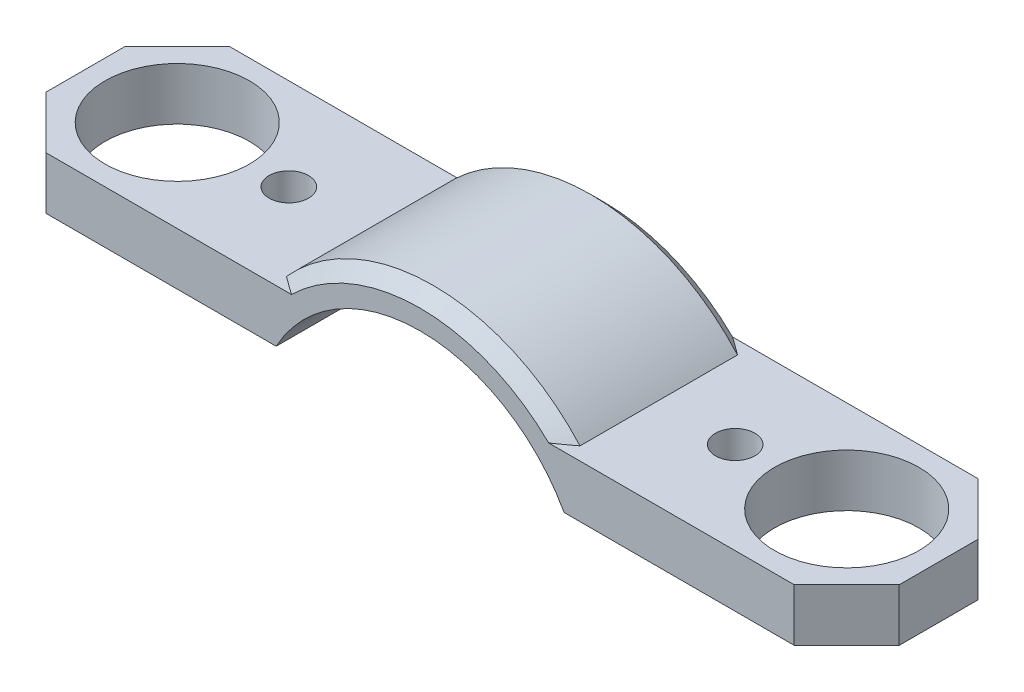
ISO-10303-21;
HEADER;
FILE_DESCRIPTION(('STEP AP214'),'2;1');
FILE_NAME('part.step','',(''),(''),'','','');
FILE_SCHEMA(('AUTOMOTIVE_DESIGN { 1 0 10303 214 1 1 1 1 }'));
ENDSEC;
DATA;
#1=APPLICATION_CONTEXT('core data for automotive mechanical design processes');
#2=APPLICATION_PROTOCOL_DEFINITION('international standard','automotive_design',2000,#1);
#3=PRODUCT_CONTEXT('',#1,'mechanical');
#4=PRODUCT('Part','Part','',(#3));
#5=PRODUCT_RELATED_PRODUCT_CATEGORY('part','',(#4));
#6=PRODUCT_DEFINITION_FORMATION('','',#4);
#7=PRODUCT_DEFINITION_CONTEXT('part definition',#1,'design');
#8=PRODUCT_DEFINITION('design','',#6,#7);
#9=PRODUCT_DEFINITION_SHAPE('','',#8);
#10=(LENGTH_UNIT() NAMED_UNIT(*) SI_UNIT(.MILLI.,.METRE.));
#11=(NAMED_UNIT(*) PLANE_ANGLE_UNIT() SI_UNIT($,.RADIAN.));
#12=(NAMED_UNIT(*) SI_UNIT($,.STERADIAN.) SOLID_ANGLE_UNIT());
#13=UNCERTAINTY_MEASURE_WITH_UNIT(LENGTH_MEASURE(1.E-05),#10,'distance_accuracy_value','');
#14=(GEOMETRIC_REPRESENTATION_CONTEXT(3) GLOBAL_UNCERTAINTY_ASSIGNED_CONTEXT((#13)) GLOBAL_UNIT_ASSIGNED_CONTEXT((#10,
#11,#12)) REPRESENTATION_CONTEXT('',''));
#15=CARTESIAN_POINT('',(0.,0.,0.));
#16=DIRECTION('',(0.,0.,1.));
#17=DIRECTION('',(1.,0.,0.));
#18=AXIS2_PLACEMENT_3D('',#15,#16,#17);
#19=CARTESIAN_POINT('',(0.,-4.,0.));
#20=DIRECTION('',(0.,1.,0.));
#21=DIRECTION('',(0.,0.,1.));
#22=AXIS2_PLACEMENT_3D('',#19,#20,#21);
#23=PLANE('',#22);
#24=CARTESIAN_POINT('',(13.6739012317805,-4.,2.35283109435819));
#25=DIRECTION('',(0.,-1.,0.));
#26=DIRECTION('',(0.,0.,-1.));
#27=AXIS2_PLACEMENT_3D('',#24,#25,#26);
#28=CIRCLE('',#27,1.5);
#29=CARTESIAN_POINT('',(13.6739012317805,-4.,0.852831094358193));
#30=VERTEX_POINT('',#29);
#31=EDGE_CURVE('E331',#30,#30,#28,.T.);
#32=ORIENTED_EDGE('',*,*,#31,.F.);
#33=EDGE_LOOP('',(#32));
#34=FACE_BOUND('',#33,.T.);
#35=CARTESIAN_POINT('',(22.1739012317805,-4.,2.35283109435819));
#36=DIRECTION('',(0.,-1.,0.));
#37=DIRECTION('',(0.,0.,-1.));
#38=AXIS2_PLACEMENT_3D('',#35,#36,#37);
#39=CIRCLE('',#38,5.5);
#40=CARTESIAN_POINT('',(22.1739012317805,-4.,-3.1471689056418));
#41=VERTEX_POINT('',#40);
#42=EDGE_CURVE('E319',#41,#41,#39,.T.);
#43=ORIENTED_EDGE('',*,*,#42,.F.);
#44=EDGE_LOOP('',(#43));
#45=FACE_BOUND('',#44,.T.);
#46=DIRECTION('',(-1.,0.,0.));
#47=VECTOR('',#46,1.);
#48=CARTESIAN_POINT('',(-35.8260987682195,-4.,-4.64716890564181));
#49=LINE('',#48,#47);
#50=CARTESIAN_POINT('',(25.1739012317805,-4.,-4.64716890564181));
#51=VERTEX_POINT('',#50);
#52=CARTESIAN_POINT('',(7.6397573315112,-4.,-4.64716890564181));
#53=VERTEX_POINT('',#52);
#54=EDGE_CURVE('E161',#51,#53,#49,.T.);
#55=ORIENTED_EDGE('',*,*,#54,.F.);
#56=DIRECTION('',(-0.707106781186549,0.,-0.707106781186546));
#57=VECTOR('',#56,1.);
#58=CARTESIAN_POINT('',(29.1739012317805,-4.,-0.647168905641817));
#59=LINE('',#58,#57);
#60=CARTESIAN_POINT('',(29.1739012317805,-4.,-0.647168905641816));
#61=VERTEX_POINT('',#60);
#62=EDGE_CURVE('E223',#51,#61,#59,.F.);
#63=ORIENTED_EDGE('',*,*,#62,.T.);
#64=DIRECTION('',(0.,0.,-1.));
#65=VECTOR('',#64,1.);
#66=CARTESIAN_POINT('',(29.1739012317805,-4.,-4.64716890564181));
#67=LINE('',#66,#65);
#68=CARTESIAN_POINT('',(29.1739012317805,-4.,5.35283109435819));
#69=VERTEX_POINT('',#68);
#70=EDGE_CURVE('E167',#69,#61,#67,.T.);
#71=ORIENTED_EDGE('',*,*,#70,.F.);
#72=DIRECTION('',(0.707106781186546,0.,-0.707106781186549));
#73=VECTOR('',#72,1.);
#74=CARTESIAN_POINT('',(25.1739012317806,-4.,9.35283109435819));
#75=LINE('',#74,#73);
#76=CARTESIAN_POINT('',(25.1739012317806,-4.,9.35283109435819));
#77=VERTEX_POINT('',#76);
#78=EDGE_CURVE('E221',#69,#77,#75,.F.);
#79=ORIENTED_EDGE('',*,*,#78,.T.);
#80=DIRECTION('',(1.,0.,0.));
#81=VECTOR('',#80,1.);
#82=CARTESIAN_POINT('',(-35.8260987682195,-4.,9.35283109435819));
#83=LINE('',#82,#81);
#84=CARTESIAN_POINT('',(7.6397573315112,-4.,9.35283109435819));
#85=VERTEX_POINT('',#84);
#86=EDGE_CURVE('E310',#85,#77,#83,.T.);
#87=ORIENTED_EDGE('',*,*,#86,.F.);
#88=DIRECTION('',(0.,0.,-1.));
#89=VECTOR('',#88,1.);
#90=CARTESIAN_POINT('',(7.6397573315112,-4.,9.35283109435819));
#91=LINE('',#90,#89);
#92=EDGE_CURVE('E150',#85,#53,#91,.T.);
#93=ORIENTED_EDGE('',*,*,#92,.T.);
#94=EDGE_LOOP('',(#55,#63,#71,#79,#87,#93));
#95=FACE_BOUND('',#94,.T.);
#96=ADVANCED_FACE('F33',(#34,#45,#95),#23,.F.);
#97=CARTESIAN_POINT('',(0.,0.,0.));
#98=DIRECTION('',(0.,1.,0.));
#99=DIRECTION('',(0.,0.,1.));
#100=AXIS2_PLACEMENT_3D('',#97,#98,#99);
#101=PLANE('',#100);
#102=DIRECTION('',(0.,0.,-1.));
#103=VECTOR('',#102,1.);
#104=CARTESIAN_POINT('',(29.1739012317805,0.,-4.64716890564181));
#105=LINE('',#104,#103);
#106=CARTESIAN_POINT('',(29.1739012317805,0.,5.35283109435819));
#107=VERTEX_POINT('',#106);
#108=CARTESIAN_POINT('',(29.1739012317805,0.,-0.647168905641813));
#109=VERTEX_POINT('',#108);
#110=EDGE_CURVE('E180',#107,#109,#105,.T.);
#111=ORIENTED_EDGE('',*,*,#110,.T.);
#112=DIRECTION('',(0.707106781186549,0.,0.707106781186546));
#113=VECTOR('',#112,1.);
#114=CARTESIAN_POINT('',(14.9105350687111,0.,-14.9105350687112));
#115=LINE('',#114,#113);
#116=CARTESIAN_POINT('',(25.1739012317805,0.,-4.64716890564181));
#117=VERTEX_POINT('',#116);
#118=EDGE_CURVE('E219',#109,#117,#115,.F.);
#119=ORIENTED_EDGE('',*,*,#118,.T.);
#120=DIRECTION('',(-1.,0.,0.));
#121=VECTOR('',#120,1.);
#122=CARTESIAN_POINT('',(-35.8260987682195,0.,-4.64716890564181));
#123=LINE('',#122,#121);
#124=CARTESIAN_POINT('',(6.47186020291327,0.,-4.64716890564181));
#125=VERTEX_POINT('',#124);
#126=EDGE_CURVE('E184',#117,#125,#123,.T.);
#127=ORIENTED_EDGE('',*,*,#126,.T.);
#128=CARTESIAN_POINT('',(6.47186020291327,0.,-4.64716890564181));
#129=CARTESIAN_POINT('',(6.58835406583274,0.,-4.56563878984489));
#130=CARTESIAN_POINT('',(6.7045002071197,0.,-4.48361298310186));
#131=CARTESIAN_POINT('',(6.93612812483899,0.,-4.31864203807849));
#132=CARTESIAN_POINT('',(7.05160993790389,0.,-4.23569695124202));
#133=CARTESIAN_POINT('',(7.28195258256229,0.,-4.06895087953328));
#134=CARTESIAN_POINT('',(7.39681341770906,0.,-3.98514989956645));
#135=CARTESIAN_POINT('',(7.62595525736224,0.,-3.81674548549887));
#136=CARTESIAN_POINT('',(7.74023622922977,0.,-3.7321420069802));
#137=CARTESIAN_POINT('',(7.85424111927951,0.,-3.64716890564184));
#138=B_SPLINE_CURVE_WITH_KNOTS('',3,(#128,#129,#130,#131,#132,#133,#134,#135,#136,#137),
.UNSPECIFIED.,.F.,.F.,(4,2,2,2,4),(0.,0.426567590976708,0.853111430127949,1.27965282597465,
1.70621797007616),.UNSPECIFIED.);
#139=CARTESIAN_POINT('',(7.85424111927949,0.,-3.64716890564182));
#140=VERTEX_POINT('',#139);
#141=EDGE_CURVE('E234',#125,#140,#138,.T.);
#142=ORIENTED_EDGE('',*,*,#141,.T.);
#143=DIRECTION('',(0.,0.,-1.));
#144=VECTOR('',#143,1.);
#145=CARTESIAN_POINT('',(7.85424111927949,0.,9.35283109435819));
#146=LINE('',#145,#144);
#147=CARTESIAN_POINT('',(7.85424111927949,0.,8.3528310943582));
#148=VERTEX_POINT('',#147);
#149=EDGE_CURVE('E151',#148,#140,#146,.T.);
#150=ORIENTED_EDGE('',*,*,#149,.F.);
#151=CARTESIAN_POINT('',(7.85424111927949,0.,8.3528310943582));
#152=CARTESIAN_POINT('',(7.74023622922976,0.,8.43780419569658));
#153=CARTESIAN_POINT('',(7.62595525736224,0.,8.52240767421525));
#154=CARTESIAN_POINT('',(7.39681341770905,0.,8.69081208828284));
#155=CARTESIAN_POINT('',(7.28195258256228,0.,8.77461306824967));
#156=CARTESIAN_POINT('',(7.05160993790387,0.,8.9413591399584));
#157=CARTESIAN_POINT('',(6.93612812483897,0.,9.02430422679487));
#158=CARTESIAN_POINT('',(6.70450020711968,0.,9.18927517181825));
#159=CARTESIAN_POINT('',(6.58835406583272,0.,9.2713009785613));
#160=CARTESIAN_POINT('',(6.47186020291327,0.,9.35283109435824));
#161=B_SPLINE_CURVE_WITH_KNOTS('',3,(#151,#152,#153,#154,#155,#156,#157,#158,#159,#160),
.UNSPECIFIED.,.F.,.F.,(4,2,2,2,4),(0.,0.426565144101509,0.853106539948222,1.27965037909947,
1.70621797007619),.UNSPECIFIED.);
#162=CARTESIAN_POINT('',(6.47186020291324,0.,9.35283109435819));
#163=VERTEX_POINT('',#162);
#164=EDGE_CURVE('E46',#148,#163,#161,.T.);
#165=ORIENTED_EDGE('',*,*,#164,.T.);
#166=DIRECTION('',(1.,0.,0.));
#167=VECTOR('',#166,1.);
#168=CARTESIAN_POINT('',(-35.8260987682195,0.,9.35283109435819));
#169=LINE('',#168,#167);
#170=CARTESIAN_POINT('',(25.1739012317806,0.,9.35283109435819));
#171=VERTEX_POINT('',#170);
#172=EDGE_CURVE('E53',#163,#171,#169,.T.);
#173=ORIENTED_EDGE('',*,*,#172,.T.);
#174=DIRECTION('',(-0.707106781186546,0.,0.707106781186549));
#175=VECTOR('',#174,1.);
#176=CARTESIAN_POINT('',(17.2633661630694,0.,17.2633661630694));
#177=LINE('',#176,#175);
#178=EDGE_CURVE('E217',#171,#107,#177,.F.);
#179=ORIENTED_EDGE('',*,*,#178,.T.);
#180=EDGE_LOOP('',(#111,#119,#127,#142,#150,#165,#173,#179));
#181=FACE_BOUND('',#180,.T.);
#182=CARTESIAN_POINT('',(22.1739012317805,0.,2.35283109435819));
#183=DIRECTION('',(0.,-1.,0.));
#184=DIRECTION('',(0.,0.,-1.));
#185=AXIS2_PLACEMENT_3D('',#182,#183,#184);
#186=CIRCLE('',#185,5.5);
#187=CARTESIAN_POINT('',(22.1739012317805,0.,-3.1471689056418));
#188=VERTEX_POINT('',#187);
#189=EDGE_CURVE('E316',#188,#188,#186,.T.);
#190=ORIENTED_EDGE('',*,*,#189,.T.);
#191=EDGE_LOOP('',(#190));
#192=FACE_BOUND('',#191,.T.);
#193=CARTESIAN_POINT('',(13.6739012317805,0.,2.35283109435819));
#194=DIRECTION('',(0.,-1.,0.));
#195=DIRECTION('',(0.,0.,-1.));
#196=AXIS2_PLACEMENT_3D('',#193,#194,#195);
#197=CIRCLE('',#196,1.5);
#198=CARTESIAN_POINT('',(13.6739012317805,0.,0.852831094358193));
#199=VERTEX_POINT('',#198);
#200=EDGE_CURVE('E328',#199,#199,#197,.T.);
#201=ORIENTED_EDGE('',*,*,#200,.T.);
#202=EDGE_LOOP('',(#201));
#203=FACE_BOUND('',#202,.T.);
#204=ADVANCED_FACE('F252',(#181,#192,#203),#101,.T.);
#205=CARTESIAN_POINT('',(-35.8260987682195,-4.,-4.64716890564181));
#206=DIRECTION('',(-1.,0.,0.));
#207=DIRECTION('',(0.,0.,1.));
#208=AXIS2_PLACEMENT_3D('',#205,#206,#207);
#209=PLANE('',#208);
#210=DIRECTION('',(0.,0.,1.));
#211=VECTOR('',#210,1.);
#212=CARTESIAN_POINT('',(-35.8260987682195,0.,-4.64716890564181));
#213=LINE('',#212,#211);
#214=CARTESIAN_POINT('',(-35.8260987682195,0.,-0.647168905641802));
#215=VERTEX_POINT('',#214);
#216=CARTESIAN_POINT('',(-35.8260987682195,0.,5.35283109435819));
#217=VERTEX_POINT('',#216);
#218=EDGE_CURVE('E175',#215,#217,#213,.T.);
#219=ORIENTED_EDGE('',*,*,#218,.F.);
#220=DIRECTION('',(0.,-1.,0.));
#221=VECTOR('',#220,1.);
#222=CARTESIAN_POINT('',(-35.8260987682195,-4.,-0.647168905641802));
#223=LINE('',#222,#221);
#224=CARTESIAN_POINT('',(-35.8260987682195,-4.,-0.647168905641802));
#225=VERTEX_POINT('',#224);
#226=EDGE_CURVE('E203',#215,#225,#223,.T.);
#227=ORIENTED_EDGE('',*,*,#226,.T.);
#228=DIRECTION('',(0.,0.,1.));
#229=VECTOR('',#228,1.);
#230=CARTESIAN_POINT('',(-35.8260987682195,-4.,-4.64716890564181));
#231=LINE('',#230,#229);
#232=CARTESIAN_POINT('',(-35.8260987682195,-4.,5.3528310943582));
#233=VERTEX_POINT('',#232);
#234=EDGE_CURVE('E186',#225,#233,#231,.T.);
#235=ORIENTED_EDGE('',*,*,#234,.T.);
#236=DIRECTION('',(0.,1.,0.));
#237=VECTOR('',#236,1.);
#238=CARTESIAN_POINT('',(-35.8260987682195,-4.,5.3528310943582));
#239=LINE('',#238,#237);
#240=EDGE_CURVE('E200',#233,#217,#239,.T.);
#241=ORIENTED_EDGE('',*,*,#240,.T.);
#242=EDGE_LOOP('',(#219,#227,#235,#241));
#243=FACE_BOUND('',#242,.T.);
#244=ADVANCED_FACE('F280',(#243),#209,.T.);
#245=CARTESIAN_POINT('',(-35.8260987682195,-4.,-4.64716890564181));
#246=DIRECTION('',(0.,0.,-1.));
#247=DIRECTION('',(-1.,0.,0.));
#248=AXIS2_PLACEMENT_3D('',#245,#246,#247);
#249=PLANE('',#248);
#250=CARTESIAN_POINT('',(-3.32609876821946,-10.,-4.64716890564181));
#251=DIRECTION('',(0.,0.,-1.));
#252=DIRECTION('',(-1.,0.,0.));
#253=AXIS2_PLACEMENT_3D('',#250,#251,#252);
#254=CIRCLE('',#253,14.);
#255=CARTESIAN_POINT('',(-13.1240577393522,0.,-4.64716890564181));
#256=VERTEX_POINT('',#255);
#257=EDGE_CURVE('E225',#256,#125,#254,.T.);
#258=ORIENTED_EDGE('',*,*,#257,.T.);
#259=ORIENTED_EDGE('',*,*,#126,.F.);
#260=DIRECTION('',(0.,-1.,0.));
#261=VECTOR('',#260,1.);
#262=CARTESIAN_POINT('',(25.1739012317805,-4.,-4.64716890564181));
#263=LINE('',#262,#261);
#264=EDGE_CURVE('E192',#117,#51,#263,.T.);
#265=ORIENTED_EDGE('',*,*,#264,.T.);
#266=ORIENTED_EDGE('',*,*,#54,.T.);
#267=CARTESIAN_POINT('',(-3.32609876821946,-10.,-4.64716890564181));
#268=DIRECTION('',(0.,0.,-1.));
#269=DIRECTION('',(-1.,0.,0.));
#270=AXIS2_PLACEMENT_3D('',#267,#268,#269);
#271=CIRCLE('',#270,12.5);
#272=CARTESIAN_POINT('',(-14.2919548679501,-4.,-4.64716890564181));
#273=VERTEX_POINT('',#272);
#274=EDGE_CURVE('E143',#273,#53,#271,.T.);
#275=ORIENTED_EDGE('',*,*,#274,.F.);
#276=CARTESIAN_POINT('',(-31.8260987682195,-4.,-4.64716890564181));
#277=VERTEX_POINT('',#276);
#278=EDGE_CURVE('E158',#273,#277,#49,.T.);
#279=ORIENTED_EDGE('',*,*,#278,.T.);
#280=DIRECTION('',(0.,1.,0.));
#281=VECTOR('',#280,1.);
#282=CARTESIAN_POINT('',(-31.8260987682195,-4.,-4.64716890564181));
#283=LINE('',#282,#281);
#284=CARTESIAN_POINT('',(-31.8260987682195,0.,-4.64716890564181));
#285=VERTEX_POINT('',#284);
#286=EDGE_CURVE('E194',#277,#285,#283,.T.);
#287=ORIENTED_EDGE('',*,*,#286,.T.);
#288=EDGE_CURVE('E183',#256,#285,#123,.T.);
#289=ORIENTED_EDGE('',*,*,#288,.F.);
#290=EDGE_LOOP('',(#258,#259,#265,#266,#275,#279,#287,#289));
#291=FACE_BOUND('',#290,.T.);
#292=ADVANCED_FACE('F156',(#291),#249,.T.);
#293=CARTESIAN_POINT('',(29.1739012317805,-4.,-4.64716890564181));
#294=DIRECTION('',(1.,0.,0.));
#295=DIRECTION('',(0.,0.,-1.));
#296=AXIS2_PLACEMENT_3D('',#293,#294,#295);
#297=PLANE('',#296);
#298=ORIENTED_EDGE('',*,*,#70,.T.);
#299=DIRECTION('',(0.,1.,0.));
#300=VECTOR('',#299,1.);
#301=CARTESIAN_POINT('',(29.1739012317805,-4.,-0.647168905641817));
#302=LINE('',#301,#300);
#303=EDGE_CURVE('E214',#61,#109,#302,.T.);
#304=ORIENTED_EDGE('',*,*,#303,.T.);
#305=ORIENTED_EDGE('',*,*,#110,.F.);
#306=DIRECTION('',(0.,-1.,0.));
#307=VECTOR('',#306,1.);
#308=CARTESIAN_POINT('',(29.1739012317805,-4.,5.35283109435819));
#309=LINE('',#308,#307);
#310=EDGE_CURVE('E212',#107,#69,#309,.T.);
#311=ORIENTED_EDGE('',*,*,#310,.T.);
#312=EDGE_LOOP('',(#298,#304,#305,#311));
#313=FACE_BOUND('',#312,.T.);
#314=ADVANCED_FACE('F300',(#313),#297,.T.);
#315=CARTESIAN_POINT('',(-35.8260987682195,-4.,9.35283109435819));
#316=DIRECTION('',(0.,0.,1.));
#317=DIRECTION('',(1.,0.,0.));
#318=AXIS2_PLACEMENT_3D('',#315,#316,#317);
#319=PLANE('',#318);
#320=ORIENTED_EDGE('',*,*,#172,.F.);
#321=CARTESIAN_POINT('',(-3.32609876821946,-10.,9.35283109435819));
#322=DIRECTION('',(0.,0.,1.));
#323=DIRECTION('',(1.,0.,0.));
#324=AXIS2_PLACEMENT_3D('',#321,#322,#323);
#325=CIRCLE('',#324,14.);
#326=CARTESIAN_POINT('',(-13.1240577393522,0.,9.35283109435819));
#327=VERTEX_POINT('',#326);
#328=EDGE_CURVE('E232',#163,#327,#325,.T.);
#329=ORIENTED_EDGE('',*,*,#328,.T.);
#330=CARTESIAN_POINT('',(-31.8260987682194,0.,9.35283109435819));
#331=VERTEX_POINT('',#330);
#332=EDGE_CURVE('E60',#331,#327,#169,.T.);
#333=ORIENTED_EDGE('',*,*,#332,.F.);
#334=DIRECTION('',(0.,-1.,0.));
#335=VECTOR('',#334,1.);
#336=CARTESIAN_POINT('',(-31.8260987682194,-4.,9.35283109435819));
#337=LINE('',#336,#335);
#338=CARTESIAN_POINT('',(-31.8260987682194,-4.,9.35283109435819));
#339=VERTEX_POINT('',#338);
#340=EDGE_CURVE('E210',#331,#339,#337,.T.);
#341=ORIENTED_EDGE('',*,*,#340,.T.);
#342=CARTESIAN_POINT('',(-14.2919548679501,-4.,9.35283109435819));
#343=VERTEX_POINT('',#342);
#344=EDGE_CURVE('E171',#339,#343,#83,.T.);
#345=ORIENTED_EDGE('',*,*,#344,.T.);
#346=CARTESIAN_POINT('',(-3.32609876821946,-10.,9.35283109435819));
#347=DIRECTION('',(0.,0.,-1.));
#348=DIRECTION('',(-1.,0.,0.));
#349=AXIS2_PLACEMENT_3D('',#346,#347,#348);
#350=CIRCLE('',#349,12.5);
#351=EDGE_CURVE('E146',#343,#85,#350,.T.);
#352=ORIENTED_EDGE('',*,*,#351,.T.);
#353=ORIENTED_EDGE('',*,*,#86,.T.);
#354=DIRECTION('',(0.,1.,0.));
#355=VECTOR('',#354,1.);
#356=CARTESIAN_POINT('',(25.1739012317806,-4.,9.35283109435819));
#357=LINE('',#356,#355);
#358=EDGE_CURVE('E208',#77,#171,#357,.T.);
#359=ORIENTED_EDGE('',*,*,#358,.T.);
#360=EDGE_LOOP('',(#320,#329,#333,#341,#345,#352,#353,#359));
#361=FACE_BOUND('',#360,.T.);
#362=ADVANCED_FACE('F287',(#361),#319,.T.);
#363=CARTESIAN_POINT('',(-20.3260987682195,-4.,2.35283109435819));
#364=DIRECTION('',(0.,-1.,0.));
#365=DIRECTION('',(0.,0.,-1.));
#366=AXIS2_PLACEMENT_3D('',#363,#364,#365);
#367=CIRCLE('',#366,1.5);
#368=CARTESIAN_POINT('',(-20.3260987682195,-4.,0.852831094358193));
#369=VERTEX_POINT('',#368);
#370=EDGE_CURVE('E325',#369,#369,#367,.T.);
#371=ORIENTED_EDGE('',*,*,#370,.F.);
#372=EDGE_LOOP('',(#371));
#373=FACE_BOUND('',#372,.T.);
#374=CARTESIAN_POINT('',(-28.8260987682195,-4.,2.35283109435819));
#375=DIRECTION('',(0.,-1.,0.));
#376=DIRECTION('',(0.,0.,-1.));
#377=AXIS2_PLACEMENT_3D('',#374,#375,#376);
#378=CIRCLE('',#377,5.5);
#379=CARTESIAN_POINT('',(-28.8260987682195,-4.,-3.1471689056418));
#380=VERTEX_POINT('',#379);
#381=EDGE_CURVE('E313',#380,#380,#378,.T.);
#382=ORIENTED_EDGE('',*,*,#381,.F.);
#383=EDGE_LOOP('',(#382));
#384=FACE_BOUND('',#383,.T.);
#385=ORIENTED_EDGE('',*,*,#234,.F.);
#386=DIRECTION('',(-0.707106781186546,0.,0.707106781186549));
#387=VECTOR('',#386,1.);
#388=CARTESIAN_POINT('',(-31.8260987682195,-4.,-4.64716890564181));
#389=LINE('',#388,#387);
#390=EDGE_CURVE('E166',#225,#277,#389,.F.);
#391=ORIENTED_EDGE('',*,*,#390,.T.);
#392=ORIENTED_EDGE('',*,*,#278,.F.);
#393=DIRECTION('',(0.,0.,-1.));
#394=VECTOR('',#393,1.);
#395=CARTESIAN_POINT('',(-14.2919548679501,-4.,9.35283109435819));
#396=LINE('',#395,#394);
#397=EDGE_CURVE('E140',#273,#343,#396,.F.);
#398=ORIENTED_EDGE('',*,*,#397,.T.);
#399=ORIENTED_EDGE('',*,*,#344,.F.);
#400=DIRECTION('',(0.707106781186549,0.,0.707106781186546));
#401=VECTOR('',#400,1.);
#402=CARTESIAN_POINT('',(-35.8260987682195,-4.,5.3528310943582));
#403=LINE('',#402,#401);
#404=EDGE_CURVE('E205',#339,#233,#403,.F.);
#405=ORIENTED_EDGE('',*,*,#404,.T.);
#406=EDGE_LOOP('',(#385,#391,#392,#398,#399,#405));
#407=FACE_BOUND('',#406,.T.);
#408=ADVANCED_FACE('F164',(#373,#384,#407),#23,.F.);
#409=ORIENTED_EDGE('',*,*,#288,.T.);
#410=DIRECTION('',(0.707106781186546,0.,-0.707106781186549));
#411=VECTOR('',#410,1.);
#412=CARTESIAN_POINT('',(-18.2366338369307,0.,-18.2366338369306));
#413=LINE('',#412,#411);
#414=EDGE_CURVE('E198',#285,#215,#413,.F.);
#415=ORIENTED_EDGE('',*,*,#414,.T.);
#416=ORIENTED_EDGE('',*,*,#218,.T.);
#417=DIRECTION('',(-0.707106781186549,0.,-0.707106781186546));
#418=VECTOR('',#417,1.);
#419=CARTESIAN_POINT('',(-20.5894649312888,0.,20.5894649312888));
#420=LINE('',#419,#418);
#421=EDGE_CURVE('E196',#217,#331,#420,.F.);
#422=ORIENTED_EDGE('',*,*,#421,.T.);
#423=ORIENTED_EDGE('',*,*,#332,.T.);
#424=CARTESIAN_POINT('',(-13.1240577393522,0.,9.35283109435819));
#425=CARTESIAN_POINT('',(-13.2405516022716,0.,9.27130097856128));
#426=CARTESIAN_POINT('',(-13.3566977435586,0.,9.18927517181825));
#427=CARTESIAN_POINT('',(-13.5883256612779,0.,9.02430422679488));
#428=CARTESIAN_POINT('',(-13.7038074743428,0.,8.9413591399584));
#429=CARTESIAN_POINT('',(-13.9341501190012,0.,8.77461306824967));
#430=CARTESIAN_POINT('',(-14.049010954148,0.,8.69081208828283));
#431=CARTESIAN_POINT('',(-14.2781527938012,0.,8.52240767421525));
#432=CARTESIAN_POINT('',(-14.3924337656687,0.,8.43780419569658));
#433=CARTESIAN_POINT('',(-14.5064386557184,0.,8.35283109435822));
#434=B_SPLINE_CURVE_WITH_KNOTS('',3,(#424,#425,#426,#427,#428,#429,#430,#431,#432,#433),
.UNSPECIFIED.,.F.,.F.,(4,2,2,2,4),(0.,0.426567590976716,0.853111430127964,1.27965282597467,
1.70621797007619),.UNSPECIFIED.);
#435=CARTESIAN_POINT('',(-14.5064386557184,0.,8.3528310943582));
#436=VERTEX_POINT('',#435);
#437=EDGE_CURVE('E11',#327,#436,#434,.T.);
#438=ORIENTED_EDGE('',*,*,#437,.T.);
#439=DIRECTION('',(0.,0.,-1.));
#440=VECTOR('',#439,1.);
#441=CARTESIAN_POINT('',(-14.5064386557184,0.,9.35283109435819));
#442=LINE('',#441,#440);
#443=CARTESIAN_POINT('',(-14.5064386557184,0.,-3.64716890564182));
#444=VERTEX_POINT('',#443);
#445=EDGE_CURVE('E169',#444,#436,#442,.F.);
#446=ORIENTED_EDGE('',*,*,#445,.F.);
#447=CARTESIAN_POINT('',(-14.5064386557184,0.,-3.64716890564182));
#448=CARTESIAN_POINT('',(-14.3924337656687,0.,-3.73214200698019));
#449=CARTESIAN_POINT('',(-14.2781527938012,0.,-3.81674548549887));
#450=CARTESIAN_POINT('',(-14.049010954148,0.,-3.98514989956645));
#451=CARTESIAN_POINT('',(-13.9341501190012,0.,-4.06895087953328));
#452=CARTESIAN_POINT('',(-13.7038074743428,0.,-4.23569695124201));
#453=CARTESIAN_POINT('',(-13.5883256612779,0.,-4.31864203807848));
#454=CARTESIAN_POINT('',(-13.3566977435586,0.,-4.48361298310186));
#455=CARTESIAN_POINT('',(-13.2405516022717,0.,-4.56563878984491));
#456=CARTESIAN_POINT('',(-13.1240577393522,0.,-4.64716890564185));
#457=B_SPLINE_CURVE_WITH_KNOTS('',3,(#447,#448,#449,#450,#451,#452,#453,#454,#455,#456),
.UNSPECIFIED.,.F.,.F.,(4,2,2,2,4),(0.,0.426565144101501,0.853106539948207,1.27965037909945,
1.70621797007616),.UNSPECIFIED.);
#458=EDGE_CURVE('E239',#444,#256,#457,.T.);
#459=ORIENTED_EDGE('',*,*,#458,.T.);
#460=EDGE_LOOP('',(#409,#415,#416,#422,#423,#438,#446,#459));
#461=FACE_BOUND('',#460,.T.);
#462=CARTESIAN_POINT('',(-20.3260987682195,0.,2.35283109435819));
#463=DIRECTION('',(0.,-1.,0.));
#464=DIRECTION('',(0.,0.,-1.));
#465=AXIS2_PLACEMENT_3D('',#462,#463,#464);
#466=CIRCLE('',#465,1.5);
#467=CARTESIAN_POINT('',(-20.3260987682195,0.,0.852831094358193));
#468=VERTEX_POINT('',#467);
#469=EDGE_CURVE('E322',#468,#468,#466,.T.);
#470=ORIENTED_EDGE('',*,*,#469,.T.);
#471=EDGE_LOOP('',(#470));
#472=FACE_BOUND('',#471,.T.);
#473=CARTESIAN_POINT('',(-28.8260987682195,0.,2.35283109435819));
#474=DIRECTION('',(0.,-1.,0.));
#475=DIRECTION('',(0.,0.,-1.));
#476=AXIS2_PLACEMENT_3D('',#473,#474,#475);
#477=CIRCLE('',#476,5.5);
#478=CARTESIAN_POINT('',(-28.8260987682195,0.,-3.1471689056418));
#479=VERTEX_POINT('',#478);
#480=EDGE_CURVE('E178',#479,#479,#477,.T.);
#481=ORIENTED_EDGE('',*,*,#480,.T.);
#482=EDGE_LOOP('',(#481));
#483=FACE_BOUND('',#482,.T.);
#484=ADVANCED_FACE('F246',(#461,#472,#483),#101,.T.);
#485=CARTESIAN_POINT('',(-28.8260987682195,0.,2.35283109435819));
#486=DIRECTION('',(0.,-1.,0.));
#487=DIRECTION('',(0.,0.,-1.));
#488=AXIS2_PLACEMENT_3D('',#485,#486,#487);
#489=CYLINDRICAL_SURFACE('',#488,5.5);
#490=ORIENTED_EDGE('',*,*,#480,.F.);
#491=EDGE_LOOP('',(#490));
#492=FACE_BOUND('',#491,.T.);
#493=ORIENTED_EDGE('',*,*,#381,.T.);
#494=EDGE_LOOP('',(#493));
#495=FACE_BOUND('',#494,.T.);
#496=ADVANCED_FACE('F251',(#492,#495),#489,.F.);
#497=CARTESIAN_POINT('',(22.1739012317805,0.,2.35283109435819));
#498=DIRECTION('',(0.,-1.,0.));
#499=DIRECTION('',(0.,0.,-1.));
#500=AXIS2_PLACEMENT_3D('',#497,#498,#499);
#501=CYLINDRICAL_SURFACE('',#500,5.5);
#502=ORIENTED_EDGE('',*,*,#189,.F.);
#503=EDGE_LOOP('',(#502));
#504=FACE_BOUND('',#503,.T.);
#505=ORIENTED_EDGE('',*,*,#42,.T.);
#506=EDGE_LOOP('',(#505));
#507=FACE_BOUND('',#506,.T.);
#508=ADVANCED_FACE('F350',(#504,#507),#501,.F.);
#509=CARTESIAN_POINT('',(-20.3260987682195,0.,2.35283109435819));
#510=DIRECTION('',(0.,-1.,0.));
#511=DIRECTION('',(0.,0.,-1.));
#512=AXIS2_PLACEMENT_3D('',#509,#510,#511);
#513=CYLINDRICAL_SURFACE('',#512,1.5);
#514=ORIENTED_EDGE('',*,*,#469,.F.);
#515=EDGE_LOOP('',(#514));
#516=FACE_BOUND('',#515,.T.);
#517=ORIENTED_EDGE('',*,*,#370,.T.);
#518=EDGE_LOOP('',(#517));
#519=FACE_BOUND('',#518,.T.);
#520=ADVANCED_FACE('F342',(#516,#519),#513,.F.);
#521=CARTESIAN_POINT('',(13.6739012317805,0.,2.35283109435819));
#522=DIRECTION('',(0.,-1.,0.));
#523=DIRECTION('',(0.,0.,-1.));
#524=AXIS2_PLACEMENT_3D('',#521,#522,#523);
#525=CYLINDRICAL_SURFACE('',#524,1.5);
#526=ORIENTED_EDGE('',*,*,#200,.F.);
#527=EDGE_LOOP('',(#526));
#528=FACE_BOUND('',#527,.T.);
#529=ORIENTED_EDGE('',*,*,#31,.T.);
#530=EDGE_LOOP('',(#529));
#531=FACE_BOUND('',#530,.T.);
#532=ADVANCED_FACE('F339',(#528,#531),#525,.F.);
#533=CARTESIAN_POINT('',(-3.32609876821946,-10.,9.35283109435819));
#534=DIRECTION('',(0.,0.,-1.));
#535=DIRECTION('',(-1.,0.,0.));
#536=AXIS2_PLACEMENT_3D('',#533,#534,#535);
#537=CYLINDRICAL_SURFACE('',#536,15.);
#538=ORIENTED_EDGE('',*,*,#149,.T.);
#539=CARTESIAN_POINT('',(-3.32609876821946,-10.,-3.64716890564182));
#540=DIRECTION('',(0.,0.,-1.));
#541=DIRECTION('',(-1.,0.,0.));
#542=AXIS2_PLACEMENT_3D('',#539,#540,#541);
#543=CIRCLE('',#542,15.);
#544=EDGE_CURVE('E230',#140,#444,#543,.F.);
#545=ORIENTED_EDGE('',*,*,#544,.T.);
#546=ORIENTED_EDGE('',*,*,#445,.T.);
#547=CARTESIAN_POINT('',(-3.32609876821946,-10.,8.3528310943582));
#548=DIRECTION('',(0.,0.,1.));
#549=DIRECTION('',(1.,0.,0.));
#550=AXIS2_PLACEMENT_3D('',#547,#548,#549);
#551=CIRCLE('',#550,15.);
#552=EDGE_CURVE('E227',#436,#148,#551,.F.);
#553=ORIENTED_EDGE('',*,*,#552,.T.);
#554=EDGE_LOOP('',(#538,#545,#546,#553));
#555=FACE_BOUND('',#554,.T.);
#556=ADVANCED_FACE('F292',(#555),#537,.T.);
#557=CARTESIAN_POINT('',(-3.32609876821946,-10.,9.35283109435819));
#558=DIRECTION('',(0.,0.,-1.));
#559=DIRECTION('',(-1.,0.,0.));
#560=AXIS2_PLACEMENT_3D('',#557,#558,#559);
#561=CYLINDRICAL_SURFACE('',#560,12.5);
#562=ORIENTED_EDGE('',*,*,#351,.F.);
#563=ORIENTED_EDGE('',*,*,#397,.F.);
#564=ORIENTED_EDGE('',*,*,#274,.T.);
#565=ORIENTED_EDGE('',*,*,#92,.F.);
#566=EDGE_LOOP('',(#562,#563,#564,#565));
#567=FACE_BOUND('',#566,.T.);
#568=ADVANCED_FACE('F142',(#567),#561,.F.);
#569=CARTESIAN_POINT('',(-31.8260987682195,-4.,-4.64716890564181));
#570=DIRECTION('',(0.707106781186549,0.,0.707106781186546));
#571=DIRECTION('',(0.,1.,0.));
#572=AXIS2_PLACEMENT_3D('',#569,#570,#571);
#573=PLANE('',#572);
#574=ORIENTED_EDGE('',*,*,#390,.F.);
#575=ORIENTED_EDGE('',*,*,#226,.F.);
#576=ORIENTED_EDGE('',*,*,#414,.F.);
#577=ORIENTED_EDGE('',*,*,#286,.F.);
#578=EDGE_LOOP('',(#574,#575,#576,#577));
#579=FACE_BOUND('',#578,.T.);
#580=ADVANCED_FACE('F276',(#579),#573,.F.);
#581=CARTESIAN_POINT('',(-35.8260987682195,-4.,5.3528310943582));
#582=DIRECTION('',(0.707106781186546,0.,-0.707106781186549));
#583=DIRECTION('',(0.,1.,0.));
#584=AXIS2_PLACEMENT_3D('',#581,#582,#583);
#585=PLANE('',#584);
#586=ORIENTED_EDGE('',*,*,#404,.F.);
#587=ORIENTED_EDGE('',*,*,#340,.F.);
#588=ORIENTED_EDGE('',*,*,#421,.F.);
#589=ORIENTED_EDGE('',*,*,#240,.F.);
#590=EDGE_LOOP('',(#586,#587,#588,#589));
#591=FACE_BOUND('',#590,.T.);
#592=ADVANCED_FACE('F285',(#591),#585,.F.);
#593=CARTESIAN_POINT('',(29.1739012317805,-4.,-0.647168905641817));
#594=DIRECTION('',(-0.707106781186546,0.,0.707106781186549));
#595=DIRECTION('',(0.,1.,0.));
#596=AXIS2_PLACEMENT_3D('',#593,#594,#595);
#597=PLANE('',#596);
#598=ORIENTED_EDGE('',*,*,#62,.F.);
#599=ORIENTED_EDGE('',*,*,#264,.F.);
#600=ORIENTED_EDGE('',*,*,#118,.F.);
#601=ORIENTED_EDGE('',*,*,#303,.F.);
#602=EDGE_LOOP('',(#598,#599,#600,#601));
#603=FACE_BOUND('',#602,.T.);
#604=ADVANCED_FACE('F298',(#603),#597,.F.);
#605=CARTESIAN_POINT('',(25.1739012317806,-4.,9.35283109435819));
#606=DIRECTION('',(-0.707106781186549,0.,-0.707106781186546));
#607=DIRECTION('',(0.,1.,0.));
#608=AXIS2_PLACEMENT_3D('',#605,#606,#607);
#609=PLANE('',#608);
#610=ORIENTED_EDGE('',*,*,#78,.F.);
#611=ORIENTED_EDGE('',*,*,#310,.F.);
#612=ORIENTED_EDGE('',*,*,#178,.F.);
#613=ORIENTED_EDGE('',*,*,#358,.F.);
#614=EDGE_LOOP('',(#610,#611,#612,#613));
#615=FACE_BOUND('',#614,.T.);
#616=ADVANCED_FACE('F309',(#615),#609,.F.);
#617=CARTESIAN_POINT('',(-3.32609876821946,-10.,-4.64716890564181));
#618=DIRECTION('',(0.,0.,1.));
#619=DIRECTION('',(1.,0.,0.));
#620=AXIS2_PLACEMENT_3D('',#617,#618,#619);
#621=CONICAL_SURFACE('',#620,14.,0.785398163397447);
#622=ORIENTED_EDGE('',*,*,#458,.F.);
#623=ORIENTED_EDGE('',*,*,#544,.F.);
#624=ORIENTED_EDGE('',*,*,#141,.F.);
#625=ORIENTED_EDGE('',*,*,#257,.F.);
#626=EDGE_LOOP('',(#622,#623,#624,#625));
#627=FACE_BOUND('',#626,.T.);
#628=ADVANCED_FACE('F243',(#627),#621,.T.);
#629=CARTESIAN_POINT('',(-3.32609876821946,-10.,8.3528310943582));
#630=DIRECTION('',(0.,0.,-1.));
#631=DIRECTION('',(-1.,0.,0.));
#632=AXIS2_PLACEMENT_3D('',#629,#630,#631);
#633=CONICAL_SURFACE('',#632,15.,0.785398163397454);
#634=ORIENTED_EDGE('',*,*,#437,.F.);
#635=ORIENTED_EDGE('',*,*,#328,.F.);
#636=ORIENTED_EDGE('',*,*,#164,.F.);
#637=ORIENTED_EDGE('',*,*,#552,.F.);
#638=EDGE_LOOP('',(#634,#635,#636,#637));
#639=FACE_BOUND('',#638,.T.);
#640=ADVANCED_FACE('F35',(#639),#633,.T.);
#641=CLOSED_SHELL('',(#96,#204,#244,#292,#314,#362,#408,#484,#496,#508,#520,#532,#556,#568,#580,
#592,#604,#616,#628,#640));
#642=MANIFOLD_SOLID_BREP('B2',#641);
#643=ADVANCED_BREP_SHAPE_REPRESENTATION('',(#18,#642),#14);
#644=SHAPE_DEFINITION_REPRESENTATION(#9,#643);
ENDSEC;
END-ISO-10303-21;
